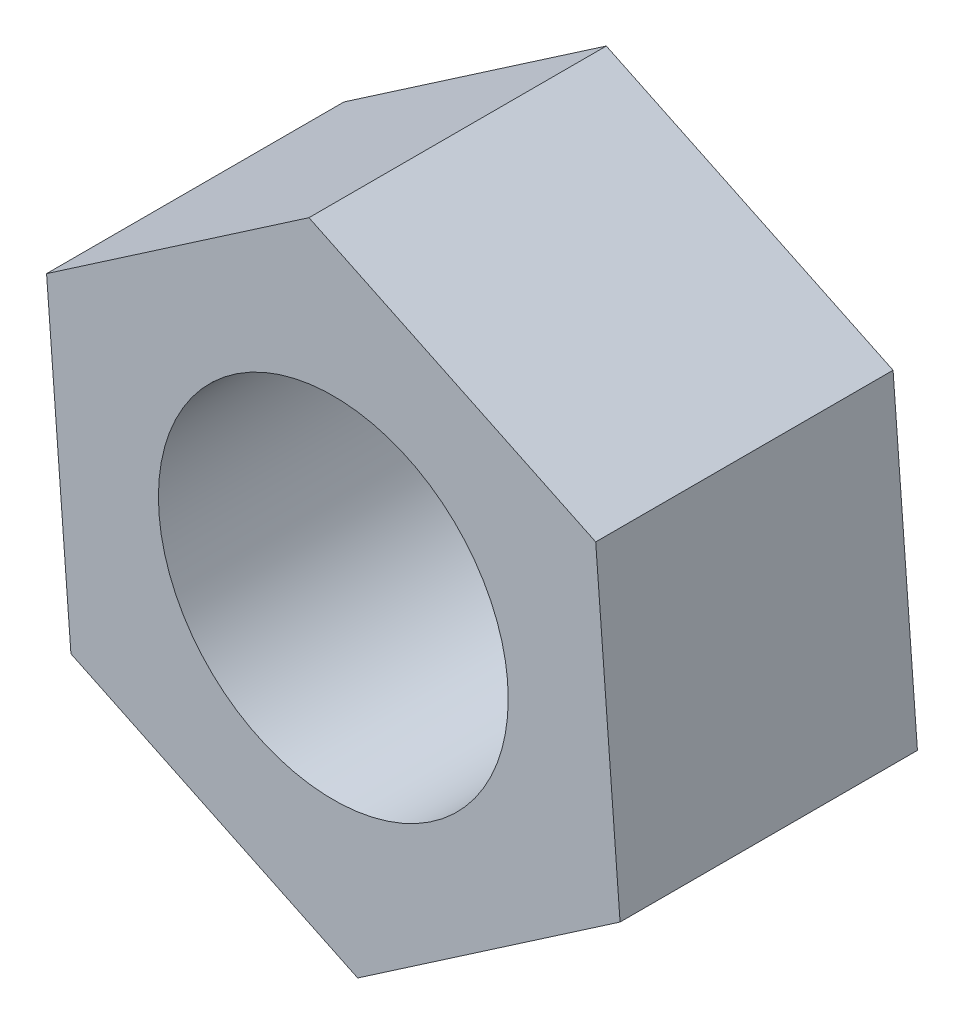
ISO-10303-21;
HEADER;
FILE_DESCRIPTION(('STEP AP214'),'2;1');
FILE_NAME('part.step','',(''),(''),'','','');
FILE_SCHEMA(('AUTOMOTIVE_DESIGN { 1 0 10303 214 1 1 1 1 }'));
ENDSEC;
DATA;
#1=APPLICATION_CONTEXT('core data for automotive mechanical design processes');
#2=APPLICATION_PROTOCOL_DEFINITION('international standard','automotive_design',2000,#1);
#3=PRODUCT_CONTEXT('',#1,'mechanical');
#4=PRODUCT('Part','Part','',(#3));
#5=PRODUCT_RELATED_PRODUCT_CATEGORY('part','',(#4));
#6=PRODUCT_DEFINITION_FORMATION('','',#4);
#7=PRODUCT_DEFINITION_CONTEXT('part definition',#1,'design');
#8=PRODUCT_DEFINITION('design','',#6,#7);
#9=PRODUCT_DEFINITION_SHAPE('','',#8);
#10=(LENGTH_UNIT() NAMED_UNIT(*) SI_UNIT(.MILLI.,.METRE.));
#11=(NAMED_UNIT(*) PLANE_ANGLE_UNIT() SI_UNIT($,.RADIAN.));
#12=(NAMED_UNIT(*) SI_UNIT($,.STERADIAN.) SOLID_ANGLE_UNIT());
#13=UNCERTAINTY_MEASURE_WITH_UNIT(LENGTH_MEASURE(1.E-05),#10,'distance_accuracy_value','');
#14=(GEOMETRIC_REPRESENTATION_CONTEXT(3) GLOBAL_UNCERTAINTY_ASSIGNED_CONTEXT((#13)) GLOBAL_UNIT_ASSIGNED_CONTEXT((#10,
#11,#12)) REPRESENTATION_CONTEXT('',''));
#15=CARTESIAN_POINT('',(0.,0.,0.));
#16=DIRECTION('',(0.,0.,1.));
#17=DIRECTION('',(1.,0.,0.));
#18=AXIS2_PLACEMENT_3D('',#15,#16,#17);
#19=CARTESIAN_POINT('',(0.,0.,6.8));
#20=DIRECTION('',(0.,0.,1.));
#21=DIRECTION('',(1.,0.,0.));
#22=AXIS2_PLACEMENT_3D('',#19,#20,#21);
#23=PLANE('',#22);
#24=DIRECTION('',(-0.90180356760263,0.43214618528823,0.));
#25=VECTOR('',#24,1.);
#26=CARTESIAN_POINT('',(6.,4.10769515458674,6.8));
#27=LINE('',#26,#25);
#28=CARTESIAN_POINT('',(6.,4.10769515458674,6.8));
#29=VERTEX_POINT('',#28);
#30=CARTESIAN_POINT('',(-0.55736835487436,7.25,6.8));
#31=VERTEX_POINT('',#30);
#32=EDGE_CURVE('E135',#29,#31,#27,.T.);
#33=ORIENTED_EDGE('',*,*,#32,.T.);
#34=DIRECTION('',(-0.825151358409459,-0.5649117061232,0.));
#35=VECTOR('',#34,1.);
#36=CARTESIAN_POINT('',(-0.55736835487436,7.25,6.8));
#37=LINE('',#36,#35);
#38=CARTESIAN_POINT('',(-6.55736835487436,3.14230484541326,6.8));
#39=VERTEX_POINT('',#38);
#40=EDGE_CURVE('E93',#31,#39,#37,.T.);
#41=ORIENTED_EDGE('',*,*,#40,.T.);
#42=DIRECTION('',(0.0766522091931708,-0.99705789141143,0.));
#43=VECTOR('',#42,1.);
#44=CARTESIAN_POINT('',(-6.55736835487436,3.14230484541326,6.8));
#45=LINE('',#44,#43);
#46=CARTESIAN_POINT('',(-6.,-4.10769515458674,6.8));
#47=VERTEX_POINT('',#46);
#48=EDGE_CURVE('E106',#39,#47,#45,.T.);
#49=ORIENTED_EDGE('',*,*,#48,.T.);
#50=DIRECTION('',(0.90180356760263,-0.43214618528823,0.));
#51=VECTOR('',#50,1.);
#52=CARTESIAN_POINT('',(-6.,-4.10769515458674,6.8));
#53=LINE('',#52,#51);
#54=CARTESIAN_POINT('',(0.557368354874363,-7.25,6.8));
#55=VERTEX_POINT('',#54);
#56=EDGE_CURVE('E100',#47,#55,#53,.T.);
#57=ORIENTED_EDGE('',*,*,#56,.T.);
#58=DIRECTION('',(0.825151358409459,0.5649117061232,0.));
#59=VECTOR('',#58,1.);
#60=CARTESIAN_POINT('',(0.557368354874363,-7.25,6.8));
#61=LINE('',#60,#59);
#62=CARTESIAN_POINT('',(6.55736835487436,-3.14230484541326,6.8));
#63=VERTEX_POINT('',#62);
#64=EDGE_CURVE('E104',#55,#63,#61,.T.);
#65=ORIENTED_EDGE('',*,*,#64,.T.);
#66=DIRECTION('',(-0.076652209193171,0.99705789141143,0.));
#67=VECTOR('',#66,1.);
#68=CARTESIAN_POINT('',(6.55736835487436,-3.14230484541326,6.8));
#69=LINE('',#68,#67);
#70=EDGE_CURVE('E56',#63,#29,#69,.T.);
#71=ORIENTED_EDGE('',*,*,#70,.T.);
#72=EDGE_LOOP('',(#33,#41,#49,#57,#65,#71));
#73=FACE_BOUND('',#72,.T.);
#74=CARTESIAN_POINT('',(0.,0.,6.8));
#75=DIRECTION('',(0.,0.,1.));
#76=DIRECTION('',(1.,0.,0.));
#77=AXIS2_PLACEMENT_3D('',#74,#75,#76);
#78=CIRCLE('',#77,4.);
#79=CARTESIAN_POINT('',(4.,0.,6.8));
#80=VERTEX_POINT('',#79);
#81=EDGE_CURVE('E128',#80,#80,#78,.T.);
#82=ORIENTED_EDGE('',*,*,#81,.F.);
#83=EDGE_LOOP('',(#82));
#84=FACE_BOUND('',#83,.T.);
#85=ADVANCED_FACE('F39',(#73,#84),#23,.T.);
#86=CARTESIAN_POINT('',(0.,0.,0.));
#87=DIRECTION('',(0.,0.,1.));
#88=DIRECTION('',(1.,0.,0.));
#89=AXIS2_PLACEMENT_3D('',#86,#87,#88);
#90=PLANE('',#89);
#91=DIRECTION('',(-0.90180356760263,0.43214618528823,0.));
#92=VECTOR('',#91,1.);
#93=CARTESIAN_POINT('',(6.,4.10769515458674,0.));
#94=LINE('',#93,#92);
#95=CARTESIAN_POINT('',(6.,4.10769515458674,0.));
#96=VERTEX_POINT('',#95);
#97=CARTESIAN_POINT('',(-0.55736835487436,7.25,0.));
#98=VERTEX_POINT('',#97);
#99=EDGE_CURVE('E124',#96,#98,#94,.T.);
#100=ORIENTED_EDGE('',*,*,#99,.F.);
#101=DIRECTION('',(-0.076652209193171,0.99705789141143,0.));
#102=VECTOR('',#101,1.);
#103=CARTESIAN_POINT('',(6.55736835487436,-3.14230484541326,0.));
#104=LINE('',#103,#102);
#105=CARTESIAN_POINT('',(6.55736835487436,-3.14230484541326,0.));
#106=VERTEX_POINT('',#105);
#107=EDGE_CURVE('E85',#106,#96,#104,.T.);
#108=ORIENTED_EDGE('',*,*,#107,.F.);
#109=DIRECTION('',(0.825151358409459,0.5649117061232,0.));
#110=VECTOR('',#109,1.);
#111=CARTESIAN_POINT('',(0.557368354874363,-7.25,0.));
#112=LINE('',#111,#110);
#113=CARTESIAN_POINT('',(0.557368354874363,-7.25,0.));
#114=VERTEX_POINT('',#113);
#115=EDGE_CURVE('E79',#114,#106,#112,.T.);
#116=ORIENTED_EDGE('',*,*,#115,.F.);
#117=DIRECTION('',(0.90180356760263,-0.43214618528823,0.));
#118=VECTOR('',#117,1.);
#119=CARTESIAN_POINT('',(-6.,-4.10769515458674,0.));
#120=LINE('',#119,#118);
#121=CARTESIAN_POINT('',(-6.,-4.10769515458674,0.));
#122=VERTEX_POINT('',#121);
#123=EDGE_CURVE('E114',#122,#114,#120,.T.);
#124=ORIENTED_EDGE('',*,*,#123,.F.);
#125=DIRECTION('',(0.0766522091931708,-0.99705789141143,0.));
#126=VECTOR('',#125,1.);
#127=CARTESIAN_POINT('',(-6.55736835487436,3.14230484541326,0.));
#128=LINE('',#127,#126);
#129=CARTESIAN_POINT('',(-6.55736835487436,3.14230484541326,0.));
#130=VERTEX_POINT('',#129);
#131=EDGE_CURVE('E130',#130,#122,#128,.T.);
#132=ORIENTED_EDGE('',*,*,#131,.F.);
#133=DIRECTION('',(-0.825151358409459,-0.5649117061232,0.));
#134=VECTOR('',#133,1.);
#135=CARTESIAN_POINT('',(-0.55736835487436,7.25,0.));
#136=LINE('',#135,#134);
#137=EDGE_CURVE('E127',#98,#130,#136,.T.);
#138=ORIENTED_EDGE('',*,*,#137,.F.);
#139=EDGE_LOOP('',(#100,#108,#116,#124,#132,#138));
#140=FACE_BOUND('',#139,.T.);
#141=CARTESIAN_POINT('',(0.,0.,0.));
#142=DIRECTION('',(0.,0.,1.));
#143=DIRECTION('',(1.,0.,0.));
#144=AXIS2_PLACEMENT_3D('',#141,#142,#143);
#145=CIRCLE('',#144,4.);
#146=CARTESIAN_POINT('',(4.,0.,0.));
#147=VERTEX_POINT('',#146);
#148=EDGE_CURVE('E228',#147,#147,#145,.T.);
#149=ORIENTED_EDGE('',*,*,#148,.T.);
#150=EDGE_LOOP('',(#149));
#151=FACE_BOUND('',#150,.T.);
#152=ADVANCED_FACE('F144',(#140,#151),#90,.F.);
#153=CARTESIAN_POINT('',(6.,4.10769515458674,6.8));
#154=DIRECTION('',(-0.43214618528823,-0.90180356760263,0.));
#155=DIRECTION('',(0.90180356760263,-0.43214618528823,0.));
#156=AXIS2_PLACEMENT_3D('',#153,#154,#155);
#157=PLANE('',#156);
#158=ORIENTED_EDGE('',*,*,#99,.T.);
#159=DIRECTION('',(0.,0.,-1.));
#160=VECTOR('',#159,1.);
#161=CARTESIAN_POINT('',(-0.55736835487436,7.25,6.8));
#162=LINE('',#161,#160);
#163=EDGE_CURVE('E11',#31,#98,#162,.T.);
#164=ORIENTED_EDGE('',*,*,#163,.F.);
#165=ORIENTED_EDGE('',*,*,#32,.F.);
#166=DIRECTION('',(0.,0.,-1.));
#167=VECTOR('',#166,1.);
#168=CARTESIAN_POINT('',(6.,4.10769515458674,6.8));
#169=LINE('',#168,#167);
#170=EDGE_CURVE('E120',#29,#96,#169,.T.);
#171=ORIENTED_EDGE('',*,*,#170,.T.);
#172=EDGE_LOOP('',(#158,#164,#165,#171));
#173=FACE_BOUND('',#172,.T.);
#174=ADVANCED_FACE('F41',(#173),#157,.F.);
#175=CARTESIAN_POINT('',(-0.55736835487436,7.25,6.8));
#176=DIRECTION('',(0.5649117061232,-0.825151358409459,0.));
#177=DIRECTION('',(0.825151358409459,0.5649117061232,0.));
#178=AXIS2_PLACEMENT_3D('',#175,#176,#177);
#179=PLANE('',#178);
#180=ORIENTED_EDGE('',*,*,#137,.T.);
#181=DIRECTION('',(0.,0.,-1.));
#182=VECTOR('',#181,1.);
#183=CARTESIAN_POINT('',(-6.55736835487436,3.14230484541326,6.8));
#184=LINE('',#183,#182);
#185=EDGE_CURVE('E48',#39,#130,#184,.T.);
#186=ORIENTED_EDGE('',*,*,#185,.F.);
#187=ORIENTED_EDGE('',*,*,#40,.F.);
#188=ORIENTED_EDGE('',*,*,#163,.T.);
#189=EDGE_LOOP('',(#180,#186,#187,#188));
#190=FACE_BOUND('',#189,.T.);
#191=ADVANCED_FACE('F169',(#190),#179,.F.);
#192=CARTESIAN_POINT('',(-6.55736835487436,3.14230484541326,6.8));
#193=DIRECTION('',(0.99705789141143,0.0766522091931708,0.));
#194=DIRECTION('',(-0.0766522091931708,0.99705789141143,0.));
#195=AXIS2_PLACEMENT_3D('',#192,#193,#194);
#196=PLANE('',#195);
#197=ORIENTED_EDGE('',*,*,#131,.T.);
#198=DIRECTION('',(0.,0.,-1.));
#199=VECTOR('',#198,1.);
#200=CARTESIAN_POINT('',(-6.,-4.10769515458674,6.8));
#201=LINE('',#200,#199);
#202=EDGE_CURVE('E115',#47,#122,#201,.T.);
#203=ORIENTED_EDGE('',*,*,#202,.F.);
#204=ORIENTED_EDGE('',*,*,#48,.F.);
#205=ORIENTED_EDGE('',*,*,#185,.T.);
#206=EDGE_LOOP('',(#197,#203,#204,#205));
#207=FACE_BOUND('',#206,.T.);
#208=ADVANCED_FACE('F141',(#207),#196,.F.);
#209=CARTESIAN_POINT('',(-6.,-4.10769515458674,6.8));
#210=DIRECTION('',(0.43214618528823,0.90180356760263,0.));
#211=DIRECTION('',(-0.90180356760263,0.43214618528823,0.));
#212=AXIS2_PLACEMENT_3D('',#209,#210,#211);
#213=PLANE('',#212);
#214=ORIENTED_EDGE('',*,*,#123,.T.);
#215=DIRECTION('',(0.,0.,-1.));
#216=VECTOR('',#215,1.);
#217=CARTESIAN_POINT('',(0.557368354874363,-7.25,6.8));
#218=LINE('',#217,#216);
#219=EDGE_CURVE('E111',#55,#114,#218,.T.);
#220=ORIENTED_EDGE('',*,*,#219,.F.);
#221=ORIENTED_EDGE('',*,*,#56,.F.);
#222=ORIENTED_EDGE('',*,*,#202,.T.);
#223=EDGE_LOOP('',(#214,#220,#221,#222));
#224=FACE_BOUND('',#223,.T.);
#225=ADVANCED_FACE('F112',(#224),#213,.F.);
#226=CARTESIAN_POINT('',(0.557368354874363,-7.25,6.8));
#227=DIRECTION('',(-0.5649117061232,0.825151358409459,0.));
#228=DIRECTION('',(-0.825151358409459,-0.5649117061232,0.));
#229=AXIS2_PLACEMENT_3D('',#226,#227,#228);
#230=PLANE('',#229);
#231=ORIENTED_EDGE('',*,*,#115,.T.);
#232=DIRECTION('',(0.,0.,-1.));
#233=VECTOR('',#232,1.);
#234=CARTESIAN_POINT('',(6.55736835487436,-3.14230484541326,6.8));
#235=LINE('',#234,#233);
#236=EDGE_CURVE('E116',#63,#106,#235,.T.);
#237=ORIENTED_EDGE('',*,*,#236,.F.);
#238=ORIENTED_EDGE('',*,*,#64,.F.);
#239=ORIENTED_EDGE('',*,*,#219,.T.);
#240=EDGE_LOOP('',(#231,#237,#238,#239));
#241=FACE_BOUND('',#240,.T.);
#242=ADVANCED_FACE('F118',(#241),#230,.F.);
#243=CARTESIAN_POINT('',(6.55736835487436,-3.14230484541326,6.8));
#244=DIRECTION('',(-0.99705789141143,-0.076652209193171,0.));
#245=DIRECTION('',(0.076652209193171,-0.99705789141143,0.));
#246=AXIS2_PLACEMENT_3D('',#243,#244,#245);
#247=PLANE('',#246);
#248=ORIENTED_EDGE('',*,*,#107,.T.);
#249=ORIENTED_EDGE('',*,*,#170,.F.);
#250=ORIENTED_EDGE('',*,*,#70,.F.);
#251=ORIENTED_EDGE('',*,*,#236,.T.);
#252=EDGE_LOOP('',(#248,#249,#250,#251));
#253=FACE_BOUND('',#252,.T.);
#254=ADVANCED_FACE('F149',(#253),#247,.F.);
#255=CARTESIAN_POINT('',(0.,0.,6.8));
#256=DIRECTION('',(0.,0.,-1.));
#257=DIRECTION('',(-1.,0.,0.));
#258=AXIS2_PLACEMENT_3D('',#255,#256,#257);
#259=CYLINDRICAL_SURFACE('',#258,4.);
#260=ORIENTED_EDGE('',*,*,#81,.T.);
#261=EDGE_LOOP('',(#260));
#262=FACE_BOUND('',#261,.T.);
#263=ORIENTED_EDGE('',*,*,#148,.F.);
#264=EDGE_LOOP('',(#263));
#265=FACE_BOUND('',#264,.T.);
#266=ADVANCED_FACE('F151',(#262,#265),#259,.F.);
#267=CLOSED_SHELL('',(#85,#152,#174,#191,#208,#225,#242,#254,#266));
#268=MANIFOLD_SOLID_BREP('B2',#267);
#269=ADVANCED_BREP_SHAPE_REPRESENTATION('',(#18,#268),#14);
#270=SHAPE_DEFINITION_REPRESENTATION(#9,#269);
ENDSEC;
END-ISO-10303-21;
